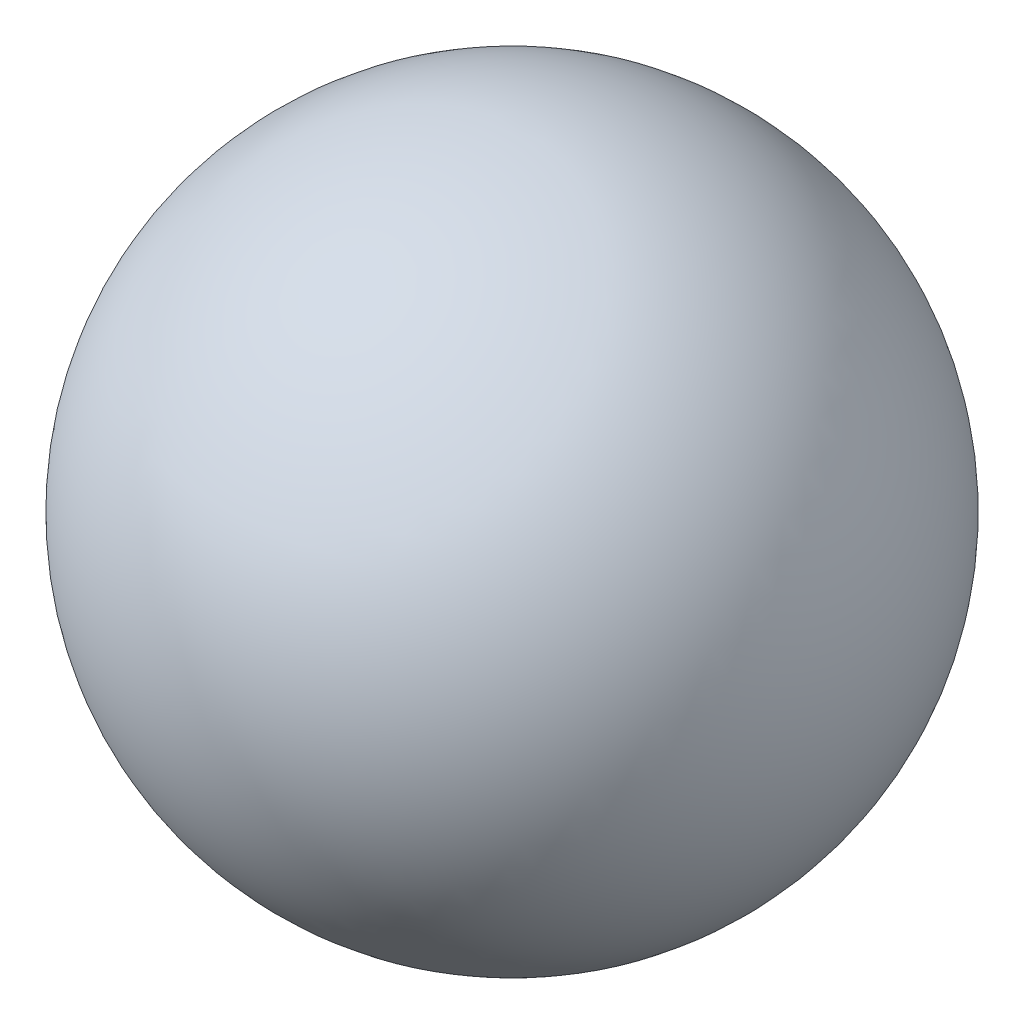
ISO-10303-21;
HEADER;
FILE_DESCRIPTION(('STEP AP214'),'2;1');
FILE_NAME('part.step','',(''),(''),'','','');
FILE_SCHEMA(('AUTOMOTIVE_DESIGN { 1 0 10303 214 1 1 1 1 }'));
ENDSEC;
DATA;
#1=APPLICATION_CONTEXT('core data for automotive mechanical design processes');
#2=APPLICATION_PROTOCOL_DEFINITION('international standard','automotive_design',2000,#1);
#3=PRODUCT_CONTEXT('',#1,'mechanical');
#4=PRODUCT('Part','Part','',(#3));
#5=PRODUCT_RELATED_PRODUCT_CATEGORY('part','',(#4));
#6=PRODUCT_DEFINITION_FORMATION('','',#4);
#7=PRODUCT_DEFINITION_CONTEXT('part definition',#1,'design');
#8=PRODUCT_DEFINITION('design','',#6,#7);
#9=PRODUCT_DEFINITION_SHAPE('','',#8);
#10=(LENGTH_UNIT() NAMED_UNIT(*) SI_UNIT(.MILLI.,.METRE.));
#11=(NAMED_UNIT(*) PLANE_ANGLE_UNIT() SI_UNIT($,.RADIAN.));
#12=(NAMED_UNIT(*) SI_UNIT($,.STERADIAN.) SOLID_ANGLE_UNIT());
#13=UNCERTAINTY_MEASURE_WITH_UNIT(LENGTH_MEASURE(1.E-05),#10,'distance_accuracy_value','');
#14=(GEOMETRIC_REPRESENTATION_CONTEXT(3) GLOBAL_UNCERTAINTY_ASSIGNED_CONTEXT((#13)) GLOBAL_UNIT_ASSIGNED_CONTEXT((#10,
#11,#12)) REPRESENTATION_CONTEXT('',''));
#15=CARTESIAN_POINT('',(0.,0.,0.));
#16=DIRECTION('',(0.,0.,1.));
#17=DIRECTION('',(1.,0.,0.));
#18=AXIS2_PLACEMENT_3D('',#15,#16,#17);
#19=CARTESIAN_POINT('',(0.,0.,0.));
#20=DIRECTION('',(0.,1.,0.));
#21=DIRECTION('',(1.,0.,0.));
#22=AXIS2_PLACEMENT_3D('',#19,#20,#21);
#23=SPHERICAL_SURFACE('',#22,90.);
#24=CARTESIAN_POINT('',(0.,90.,0.));
#25=VERTEX_POINT('',#24);
#26=VERTEX_LOOP('',#25);
#27=FACE_BOUND('',#26,.T.);
#28=ADVANCED_FACE('F33',(#27),#23,.T.);
#29=CLOSED_SHELL('',(#28));
#30=MANIFOLD_SOLID_BREP('B2',#29);
#31=ADVANCED_BREP_SHAPE_REPRESENTATION('',(#18,#30),#14);
#32=SHAPE_DEFINITION_REPRESENTATION(#9,#31);
ENDSEC;
END-ISO-10303-21;
